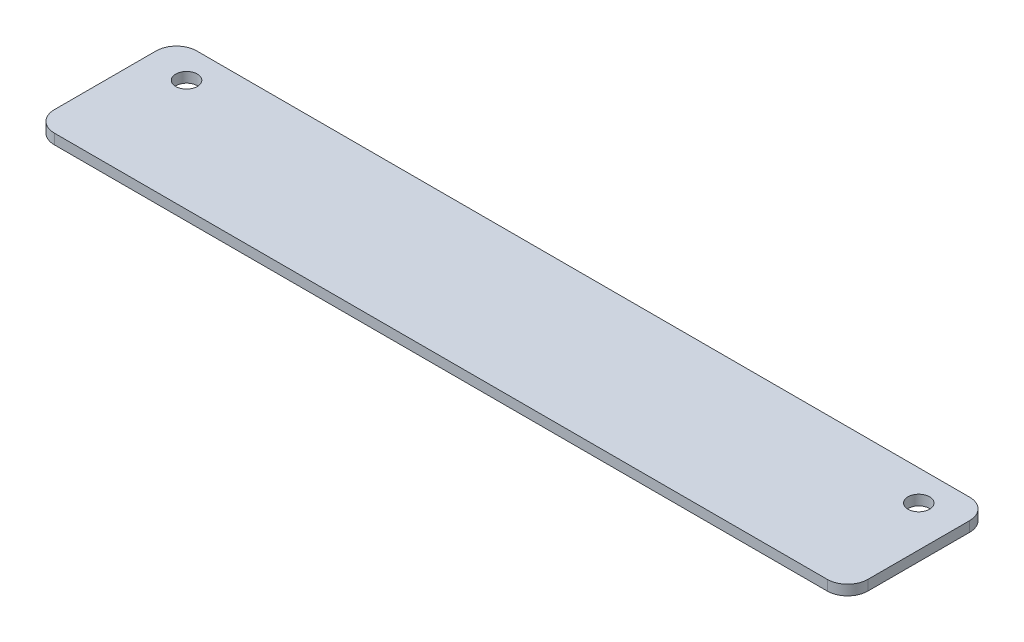
ISO-10303-21;
HEADER;
FILE_DESCRIPTION(('STEP AP214'),'2;1');
FILE_NAME('part.step','',(''),(''),'','','');
FILE_SCHEMA(('AUTOMOTIVE_DESIGN { 1 0 10303 214 1 1 1 1 }'));
ENDSEC;
DATA;
#1=APPLICATION_CONTEXT('core data for automotive mechanical design processes');
#2=APPLICATION_PROTOCOL_DEFINITION('international standard','automotive_design',2000,#1);
#3=PRODUCT_CONTEXT('',#1,'mechanical');
#4=PRODUCT('Part','Part','',(#3));
#5=PRODUCT_RELATED_PRODUCT_CATEGORY('part','',(#4));
#6=PRODUCT_DEFINITION_FORMATION('','',#4);
#7=PRODUCT_DEFINITION_CONTEXT('part definition',#1,'design');
#8=PRODUCT_DEFINITION('design','',#6,#7);
#9=PRODUCT_DEFINITION_SHAPE('','',#8);
#10=(LENGTH_UNIT() NAMED_UNIT(*) SI_UNIT(.MILLI.,.METRE.));
#11=(NAMED_UNIT(*) PLANE_ANGLE_UNIT() SI_UNIT($,.RADIAN.));
#12=(NAMED_UNIT(*) SI_UNIT($,.STERADIAN.) SOLID_ANGLE_UNIT());
#13=UNCERTAINTY_MEASURE_WITH_UNIT(LENGTH_MEASURE(1.E-05),#10,'distance_accuracy_value','');
#14=(GEOMETRIC_REPRESENTATION_CONTEXT(3) GLOBAL_UNCERTAINTY_ASSIGNED_CONTEXT((#13)) GLOBAL_UNIT_ASSIGNED_CONTEXT((#10,
#11,#12)) REPRESENTATION_CONTEXT('',''));
#15=CARTESIAN_POINT('',(0.,0.,0.));
#16=DIRECTION('',(0.,0.,1.));
#17=DIRECTION('',(1.,0.,0.));
#18=AXIS2_PLACEMENT_3D('',#15,#16,#17);
#19=CARTESIAN_POINT('',(0.,3.175,0.));
#20=DIRECTION('',(1.,0.,0.));
#21=DIRECTION('',(0.,0.,-1.));
#22=AXIS2_PLACEMENT_3D('',#19,#20,#21);
#23=PLANE('',#22);
#24=DIRECTION('',(0.,0.,1.));
#25=VECTOR('',#24,1.);
#26=CARTESIAN_POINT('',(0.,3.175,0.));
#27=LINE('',#26,#25);
#28=CARTESIAN_POINT('',(0.,3.175,-38.1));
#29=VERTEX_POINT('',#28);
#30=CARTESIAN_POINT('',(0.,3.175,-6.35));
#31=VERTEX_POINT('',#30);
#32=EDGE_CURVE('E118',#29,#31,#27,.T.);
#33=ORIENTED_EDGE('',*,*,#32,.F.);
#34=DIRECTION('',(0.,-1.,0.));
#35=VECTOR('',#34,1.);
#36=CARTESIAN_POINT('',(0.,3.175,-38.1));
#37=LINE('',#36,#35);
#38=CARTESIAN_POINT('',(0.,0.,-38.1));
#39=VERTEX_POINT('',#38);
#40=EDGE_CURVE('E103',#29,#39,#37,.T.);
#41=ORIENTED_EDGE('',*,*,#40,.T.);
#42=DIRECTION('',(0.,0.,1.));
#43=VECTOR('',#42,1.);
#44=CARTESIAN_POINT('',(0.,0.,0.));
#45=LINE('',#44,#43);
#46=CARTESIAN_POINT('',(0.,0.,-6.35));
#47=VERTEX_POINT('',#46);
#48=EDGE_CURVE('E115',#39,#47,#45,.T.);
#49=ORIENTED_EDGE('',*,*,#48,.T.);
#50=DIRECTION('',(0.,-1.,0.));
#51=VECTOR('',#50,1.);
#52=CARTESIAN_POINT('',(0.,3.175,-6.35));
#53=LINE('',#52,#51);
#54=EDGE_CURVE('E120',#47,#31,#53,.F.);
#55=ORIENTED_EDGE('',*,*,#54,.T.);
#56=EDGE_LOOP('',(#33,#41,#49,#55));
#57=FACE_BOUND('',#56,.T.);
#58=ADVANCED_FACE('F33',(#57),#23,.F.);
#59=CARTESIAN_POINT('',(0.,3.175,0.));
#60=DIRECTION('',(0.,0.,-1.));
#61=DIRECTION('',(-1.,0.,0.));
#62=AXIS2_PLACEMENT_3D('',#59,#60,#61);
#63=PLANE('',#62);
#64=DIRECTION('',(1.,0.,0.));
#65=VECTOR('',#64,1.);
#66=CARTESIAN_POINT('',(0.,0.,0.));
#67=LINE('',#66,#65);
#68=CARTESIAN_POINT('',(6.35,0.,0.));
#69=VERTEX_POINT('',#68);
#70=CARTESIAN_POINT('',(247.65,0.,0.));
#71=VERTEX_POINT('',#70);
#72=EDGE_CURVE('E124',#69,#71,#67,.T.);
#73=ORIENTED_EDGE('',*,*,#72,.T.);
#74=DIRECTION('',(0.,-1.,0.));
#75=VECTOR('',#74,1.);
#76=CARTESIAN_POINT('',(247.65,3.175,0.));
#77=LINE('',#76,#75);
#78=CARTESIAN_POINT('',(247.65,3.175,0.));
#79=VERTEX_POINT('',#78);
#80=EDGE_CURVE('E11',#71,#79,#77,.F.);
#81=ORIENTED_EDGE('',*,*,#80,.T.);
#82=DIRECTION('',(1.,0.,0.));
#83=VECTOR('',#82,1.);
#84=CARTESIAN_POINT('',(0.,3.175,0.));
#85=LINE('',#84,#83);
#86=CARTESIAN_POINT('',(6.35,3.175,0.));
#87=VERTEX_POINT('',#86);
#88=EDGE_CURVE('E164',#87,#79,#85,.T.);
#89=ORIENTED_EDGE('',*,*,#88,.F.);
#90=DIRECTION('',(0.,-1.,0.));
#91=VECTOR('',#90,1.);
#92=CARTESIAN_POINT('',(6.35,3.175,0.));
#93=LINE('',#92,#91);
#94=EDGE_CURVE('E41',#87,#69,#93,.T.);
#95=ORIENTED_EDGE('',*,*,#94,.T.);
#96=EDGE_LOOP('',(#73,#81,#89,#95));
#97=FACE_BOUND('',#96,.T.);
#98=ADVANCED_FACE('F162',(#97),#63,.F.);
#99=CARTESIAN_POINT('',(254.,3.175,0.));
#100=DIRECTION('',(-1.,0.,0.));
#101=DIRECTION('',(0.,0.,1.));
#102=AXIS2_PLACEMENT_3D('',#99,#100,#101);
#103=PLANE('',#102);
#104=DIRECTION('',(0.,0.,-1.));
#105=VECTOR('',#104,1.);
#106=CARTESIAN_POINT('',(254.,0.,0.));
#107=LINE('',#106,#105);
#108=CARTESIAN_POINT('',(254.,0.,-6.35));
#109=VERTEX_POINT('',#108);
#110=CARTESIAN_POINT('',(254.,0.,-38.1));
#111=VERTEX_POINT('',#110);
#112=EDGE_CURVE('E128',#109,#111,#107,.T.);
#113=ORIENTED_EDGE('',*,*,#112,.T.);
#114=DIRECTION('',(0.,-1.,0.));
#115=VECTOR('',#114,1.);
#116=CARTESIAN_POINT('',(254.,3.175,-38.1));
#117=LINE('',#116,#115);
#118=CARTESIAN_POINT('',(254.,3.175,-38.1));
#119=VERTEX_POINT('',#118);
#120=EDGE_CURVE('E48',#111,#119,#117,.F.);
#121=ORIENTED_EDGE('',*,*,#120,.T.);
#122=DIRECTION('',(0.,0.,-1.));
#123=VECTOR('',#122,1.);
#124=CARTESIAN_POINT('',(254.,3.175,0.));
#125=LINE('',#124,#123);
#126=CARTESIAN_POINT('',(254.,3.175,-6.35));
#127=VERTEX_POINT('',#126);
#128=EDGE_CURVE('E172',#127,#119,#125,.T.);
#129=ORIENTED_EDGE('',*,*,#128,.F.);
#130=DIRECTION('',(0.,-1.,0.));
#131=VECTOR('',#130,1.);
#132=CARTESIAN_POINT('',(254.,3.175,-6.35));
#133=LINE('',#132,#131);
#134=EDGE_CURVE('E155',#127,#109,#133,.T.);
#135=ORIENTED_EDGE('',*,*,#134,.T.);
#136=EDGE_LOOP('',(#113,#121,#129,#135));
#137=FACE_BOUND('',#136,.T.);
#138=ADVANCED_FACE('F171',(#137),#103,.F.);
#139=CARTESIAN_POINT('',(0.,3.175,-44.45));
#140=DIRECTION('',(0.,0.,1.));
#141=DIRECTION('',(1.,0.,0.));
#142=AXIS2_PLACEMENT_3D('',#139,#140,#141);
#143=PLANE('',#142);
#144=DIRECTION('',(-1.,0.,0.));
#145=VECTOR('',#144,1.);
#146=CARTESIAN_POINT('',(0.,0.,-44.45));
#147=LINE('',#146,#145);
#148=CARTESIAN_POINT('',(247.65,0.,-44.45));
#149=VERTEX_POINT('',#148);
#150=CARTESIAN_POINT('',(6.35,0.,-44.45));
#151=VERTEX_POINT('',#150);
#152=EDGE_CURVE('E138',#149,#151,#147,.T.);
#153=ORIENTED_EDGE('',*,*,#152,.T.);
#154=DIRECTION('',(0.,-1.,0.));
#155=VECTOR('',#154,1.);
#156=CARTESIAN_POINT('',(6.35,3.175,-44.45));
#157=LINE('',#156,#155);
#158=CARTESIAN_POINT('',(6.35,3.175,-44.45));
#159=VERTEX_POINT('',#158);
#160=EDGE_CURVE('E104',#151,#159,#157,.F.);
#161=ORIENTED_EDGE('',*,*,#160,.T.);
#162=DIRECTION('',(-1.,0.,0.));
#163=VECTOR('',#162,1.);
#164=CARTESIAN_POINT('',(0.,3.175,-44.45));
#165=LINE('',#164,#163);
#166=CARTESIAN_POINT('',(247.65,3.175,-44.45));
#167=VERTEX_POINT('',#166);
#168=EDGE_CURVE('E134',#167,#159,#165,.T.);
#169=ORIENTED_EDGE('',*,*,#168,.F.);
#170=DIRECTION('',(0.,-1.,0.));
#171=VECTOR('',#170,1.);
#172=CARTESIAN_POINT('',(247.65,3.175,-44.45));
#173=LINE('',#172,#171);
#174=EDGE_CURVE('E109',#167,#149,#173,.T.);
#175=ORIENTED_EDGE('',*,*,#174,.T.);
#176=EDGE_LOOP('',(#153,#161,#169,#175));
#177=FACE_BOUND('',#176,.T.);
#178=ADVANCED_FACE('F192',(#177),#143,.F.);
#179=CARTESIAN_POINT('',(0.,3.175,0.));
#180=DIRECTION('',(0.,-1.,0.));
#181=DIRECTION('',(0.,0.,-1.));
#182=AXIS2_PLACEMENT_3D('',#179,#180,#181);
#183=PLANE('',#182);
#184=CARTESIAN_POINT('',(12.7,3.175,-34.925));
#185=DIRECTION('',(0.,1.,0.));
#186=DIRECTION('',(0.,0.,1.));
#187=AXIS2_PLACEMENT_3D('',#184,#185,#186);
#188=CIRCLE('',#187,3.37350099999999);
#189=CARTESIAN_POINT('',(12.7,3.175,-31.551499));
#190=VERTEX_POINT('',#189);
#191=EDGE_CURVE('E183',#190,#190,#188,.T.);
#192=ORIENTED_EDGE('',*,*,#191,.F.);
#193=EDGE_LOOP('',(#192));
#194=FACE_BOUND('',#193,.T.);
#195=CARTESIAN_POINT('',(241.3,3.175,-34.925));
#196=DIRECTION('',(0.,1.,0.));
#197=DIRECTION('',(0.,0.,1.));
#198=AXIS2_PLACEMENT_3D('',#195,#196,#197);
#199=CIRCLE('',#198,3.373501);
#200=CARTESIAN_POINT('',(241.3,3.175,-31.551499));
#201=VERTEX_POINT('',#200);
#202=EDGE_CURVE('E131',#201,#201,#199,.T.);
#203=ORIENTED_EDGE('',*,*,#202,.F.);
#204=EDGE_LOOP('',(#203));
#205=FACE_BOUND('',#204,.T.);
#206=ORIENTED_EDGE('',*,*,#168,.T.);
#207=CARTESIAN_POINT('',(6.35,3.175,-38.1));
#208=DIRECTION('',(0.,-1.,0.));
#209=DIRECTION('',(0.,0.,-1.));
#210=AXIS2_PLACEMENT_3D('',#207,#208,#209);
#211=CIRCLE('',#210,6.35);
#212=EDGE_CURVE('E153',#159,#29,#211,.F.);
#213=ORIENTED_EDGE('',*,*,#212,.T.);
#214=ORIENTED_EDGE('',*,*,#32,.T.);
#215=CARTESIAN_POINT('',(6.35,3.175,-6.35));
#216=DIRECTION('',(0.,-1.,0.));
#217=DIRECTION('',(0.,0.,-1.));
#218=AXIS2_PLACEMENT_3D('',#215,#216,#217);
#219=CIRCLE('',#218,6.35);
#220=EDGE_CURVE('E148',#31,#87,#219,.F.);
#221=ORIENTED_EDGE('',*,*,#220,.T.);
#222=ORIENTED_EDGE('',*,*,#88,.T.);
#223=CARTESIAN_POINT('',(247.65,3.175,-6.35));
#224=DIRECTION('',(0.,-1.,0.));
#225=DIRECTION('',(0.,0.,-1.));
#226=AXIS2_PLACEMENT_3D('',#223,#224,#225);
#227=CIRCLE('',#226,6.35);
#228=EDGE_CURVE('E55',#79,#127,#227,.F.);
#229=ORIENTED_EDGE('',*,*,#228,.T.);
#230=ORIENTED_EDGE('',*,*,#128,.T.);
#231=CARTESIAN_POINT('',(247.65,3.175,-38.1));
#232=DIRECTION('',(0.,-1.,0.));
#233=DIRECTION('',(0.,0.,-1.));
#234=AXIS2_PLACEMENT_3D('',#231,#232,#233);
#235=CIRCLE('',#234,6.35);
#236=EDGE_CURVE('E151',#119,#167,#235,.F.);
#237=ORIENTED_EDGE('',*,*,#236,.T.);
#238=EDGE_LOOP('',(#206,#213,#214,#221,#222,#229,#230,#237));
#239=FACE_BOUND('',#238,.T.);
#240=ADVANCED_FACE('F189',(#194,#205,#239),#183,.F.);
#241=CARTESIAN_POINT('',(0.,0.,0.));
#242=DIRECTION('',(0.,-1.,0.));
#243=DIRECTION('',(0.,0.,-1.));
#244=AXIS2_PLACEMENT_3D('',#241,#242,#243);
#245=PLANE('',#244);
#246=CARTESIAN_POINT('',(12.7,0.,-34.925));
#247=DIRECTION('',(0.,1.,0.));
#248=DIRECTION('',(0.,0.,1.));
#249=AXIS2_PLACEMENT_3D('',#246,#247,#248);
#250=CIRCLE('',#249,3.37350099999999);
#251=CARTESIAN_POINT('',(12.7,0.,-31.551499));
#252=VERTEX_POINT('',#251);
#253=EDGE_CURVE('E180',#252,#252,#250,.T.);
#254=ORIENTED_EDGE('',*,*,#253,.T.);
#255=EDGE_LOOP('',(#254));
#256=FACE_BOUND('',#255,.T.);
#257=CARTESIAN_POINT('',(241.3,0.,-34.925));
#258=DIRECTION('',(0.,1.,0.));
#259=DIRECTION('',(0.,0.,1.));
#260=AXIS2_PLACEMENT_3D('',#257,#258,#259);
#261=CIRCLE('',#260,3.373501);
#262=CARTESIAN_POINT('',(241.3,0.,-31.551499));
#263=VERTEX_POINT('',#262);
#264=EDGE_CURVE('E125',#263,#263,#261,.T.);
#265=ORIENTED_EDGE('',*,*,#264,.T.);
#266=EDGE_LOOP('',(#265));
#267=FACE_BOUND('',#266,.T.);
#268=ORIENTED_EDGE('',*,*,#48,.F.);
#269=CARTESIAN_POINT('',(6.35,0.,-38.1));
#270=DIRECTION('',(0.,-1.,0.));
#271=DIRECTION('',(0.,0.,-1.));
#272=AXIS2_PLACEMENT_3D('',#269,#270,#271);
#273=CIRCLE('',#272,6.35);
#274=EDGE_CURVE('E99',#39,#151,#273,.T.);
#275=ORIENTED_EDGE('',*,*,#274,.T.);
#276=ORIENTED_EDGE('',*,*,#152,.F.);
#277=CARTESIAN_POINT('',(247.65,0.,-38.1));
#278=DIRECTION('',(0.,-1.,0.));
#279=DIRECTION('',(0.,0.,-1.));
#280=AXIS2_PLACEMENT_3D('',#277,#278,#279);
#281=CIRCLE('',#280,6.35);
#282=EDGE_CURVE('E110',#149,#111,#281,.T.);
#283=ORIENTED_EDGE('',*,*,#282,.T.);
#284=ORIENTED_EDGE('',*,*,#112,.F.);
#285=CARTESIAN_POINT('',(247.65,0.,-6.35));
#286=DIRECTION('',(0.,-1.,0.));
#287=DIRECTION('',(0.,0.,-1.));
#288=AXIS2_PLACEMENT_3D('',#285,#286,#287);
#289=CIRCLE('',#288,6.35);
#290=EDGE_CURVE('E142',#109,#71,#289,.T.);
#291=ORIENTED_EDGE('',*,*,#290,.T.);
#292=ORIENTED_EDGE('',*,*,#72,.F.);
#293=CARTESIAN_POINT('',(6.35,0.,-6.35));
#294=DIRECTION('',(0.,-1.,0.));
#295=DIRECTION('',(0.,0.,-1.));
#296=AXIS2_PLACEMENT_3D('',#293,#294,#295);
#297=CIRCLE('',#296,6.35);
#298=EDGE_CURVE('E119',#69,#47,#297,.T.);
#299=ORIENTED_EDGE('',*,*,#298,.T.);
#300=EDGE_LOOP('',(#268,#275,#276,#283,#284,#291,#292,#299));
#301=FACE_BOUND('',#300,.T.);
#302=ADVANCED_FACE('F122',(#256,#267,#301),#245,.T.);
#303=CARTESIAN_POINT('',(6.35,3.175,-38.1));
#304=DIRECTION('',(0.,-1.,0.));
#305=DIRECTION('',(0.,0.,-1.));
#306=AXIS2_PLACEMENT_3D('',#303,#304,#305);
#307=CYLINDRICAL_SURFACE('',#306,6.35);
#308=ORIENTED_EDGE('',*,*,#212,.F.);
#309=ORIENTED_EDGE('',*,*,#160,.F.);
#310=ORIENTED_EDGE('',*,*,#274,.F.);
#311=ORIENTED_EDGE('',*,*,#40,.F.);
#312=EDGE_LOOP('',(#308,#309,#310,#311));
#313=FACE_BOUND('',#312,.T.);
#314=ADVANCED_FACE('F102',(#313),#307,.T.);
#315=CARTESIAN_POINT('',(247.65,3.175,-38.1));
#316=DIRECTION('',(0.,-1.,0.));
#317=DIRECTION('',(0.,0.,-1.));
#318=AXIS2_PLACEMENT_3D('',#315,#316,#317);
#319=CYLINDRICAL_SURFACE('',#318,6.35);
#320=ORIENTED_EDGE('',*,*,#236,.F.);
#321=ORIENTED_EDGE('',*,*,#120,.F.);
#322=ORIENTED_EDGE('',*,*,#282,.F.);
#323=ORIENTED_EDGE('',*,*,#174,.F.);
#324=EDGE_LOOP('',(#320,#321,#322,#323));
#325=FACE_BOUND('',#324,.T.);
#326=ADVANCED_FACE('F199',(#325),#319,.T.);
#327=CARTESIAN_POINT('',(247.65,3.175,-6.35));
#328=DIRECTION('',(0.,-1.,0.));
#329=DIRECTION('',(0.,0.,-1.));
#330=AXIS2_PLACEMENT_3D('',#327,#328,#329);
#331=CYLINDRICAL_SURFACE('',#330,6.35);
#332=ORIENTED_EDGE('',*,*,#228,.F.);
#333=ORIENTED_EDGE('',*,*,#80,.F.);
#334=ORIENTED_EDGE('',*,*,#290,.F.);
#335=ORIENTED_EDGE('',*,*,#134,.F.);
#336=EDGE_LOOP('',(#332,#333,#334,#335));
#337=FACE_BOUND('',#336,.T.);
#338=ADVANCED_FACE('F170',(#337),#331,.T.);
#339=CARTESIAN_POINT('',(6.35,3.175,-6.35));
#340=DIRECTION('',(0.,-1.,0.));
#341=DIRECTION('',(0.,0.,-1.));
#342=AXIS2_PLACEMENT_3D('',#339,#340,#341);
#343=CYLINDRICAL_SURFACE('',#342,6.35);
#344=ORIENTED_EDGE('',*,*,#220,.F.);
#345=ORIENTED_EDGE('',*,*,#54,.F.);
#346=ORIENTED_EDGE('',*,*,#298,.F.);
#347=ORIENTED_EDGE('',*,*,#94,.F.);
#348=EDGE_LOOP('',(#344,#345,#346,#347));
#349=FACE_BOUND('',#348,.T.);
#350=ADVANCED_FACE('F35',(#349),#343,.T.);
#351=CARTESIAN_POINT('',(241.3,3.175,-34.925));
#352=DIRECTION('',(0.,1.,0.));
#353=DIRECTION('',(0.,0.,1.));
#354=AXIS2_PLACEMENT_3D('',#351,#352,#353);
#355=CYLINDRICAL_SURFACE('',#354,3.373501);
#356=ORIENTED_EDGE('',*,*,#264,.F.);
#357=EDGE_LOOP('',(#356));
#358=FACE_BOUND('',#357,.T.);
#359=ORIENTED_EDGE('',*,*,#202,.T.);
#360=EDGE_LOOP('',(#359));
#361=FACE_BOUND('',#360,.T.);
#362=ADVANCED_FACE('F221',(#358,#361),#355,.F.);
#363=CARTESIAN_POINT('',(12.7,3.175,-34.925));
#364=DIRECTION('',(0.,1.,0.));
#365=DIRECTION('',(0.,0.,1.));
#366=AXIS2_PLACEMENT_3D('',#363,#364,#365);
#367=CYLINDRICAL_SURFACE('',#366,3.37350099999999);
#368=ORIENTED_EDGE('',*,*,#253,.F.);
#369=EDGE_LOOP('',(#368));
#370=FACE_BOUND('',#369,.T.);
#371=ORIENTED_EDGE('',*,*,#191,.T.);
#372=EDGE_LOOP('',(#371));
#373=FACE_BOUND('',#372,.T.);
#374=ADVANCED_FACE('F187',(#370,#373),#367,.F.);
#375=CLOSED_SHELL('',(#58,#98,#138,#178,#240,#302,#314,#326,#338,#350,#362,#374));
#376=MANIFOLD_SOLID_BREP('B2',#375);
#377=ADVANCED_BREP_SHAPE_REPRESENTATION('',(#18,#376),#14);
#378=SHAPE_DEFINITION_REPRESENTATION(#9,#377);
ENDSEC;
END-ISO-10303-21;
